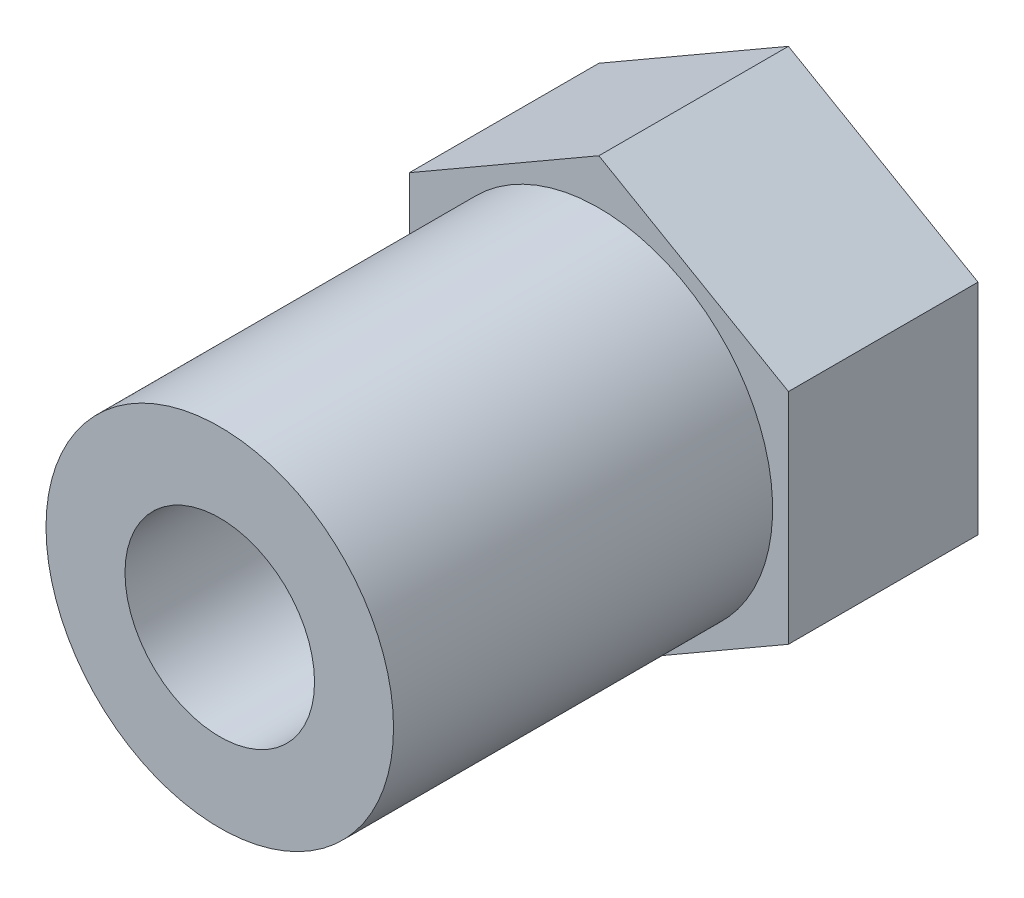
ISO-10303-21;
HEADER;
FILE_DESCRIPTION(('STEP AP214'),'2;1');
FILE_NAME('part.step','',(''),(''),'','','');
FILE_SCHEMA(('AUTOMOTIVE_DESIGN { 1 0 10303 214 1 1 1 1 }'));
ENDSEC;
DATA;
#1=APPLICATION_CONTEXT('core data for automotive mechanical design processes');
#2=APPLICATION_PROTOCOL_DEFINITION('international standard','automotive_design',2000,#1);
#3=PRODUCT_CONTEXT('',#1,'mechanical');
#4=PRODUCT('Part','Part','',(#3));
#5=PRODUCT_RELATED_PRODUCT_CATEGORY('part','',(#4));
#6=PRODUCT_DEFINITION_FORMATION('','',#4);
#7=PRODUCT_DEFINITION_CONTEXT('part definition',#1,'design');
#8=PRODUCT_DEFINITION('design','',#6,#7);
#9=PRODUCT_DEFINITION_SHAPE('','',#8);
#10=(LENGTH_UNIT() NAMED_UNIT(*) SI_UNIT(.MILLI.,.METRE.));
#11=(NAMED_UNIT(*) PLANE_ANGLE_UNIT() SI_UNIT($,.RADIAN.));
#12=(NAMED_UNIT(*) SI_UNIT($,.STERADIAN.) SOLID_ANGLE_UNIT());
#13=UNCERTAINTY_MEASURE_WITH_UNIT(LENGTH_MEASURE(1.E-05),#10,'distance_accuracy_value','');
#14=(GEOMETRIC_REPRESENTATION_CONTEXT(3) GLOBAL_UNCERTAINTY_ASSIGNED_CONTEXT((#13)) GLOBAL_UNIT_ASSIGNED_CONTEXT((#10,
#11,#12)) REPRESENTATION_CONTEXT('',''));
#15=CARTESIAN_POINT('',(0.,0.,0.));
#16=DIRECTION('',(0.,0.,1.));
#17=DIRECTION('',(1.,0.,0.));
#18=AXIS2_PLACEMENT_3D('',#15,#16,#17);
#19=CARTESIAN_POINT('',(0.,0.,18.));
#20=DIRECTION('',(0.,0.,-1.));
#21=DIRECTION('',(-1.,0.,0.));
#22=AXIS2_PLACEMENT_3D('',#19,#20,#21);
#23=CYLINDRICAL_SURFACE('',#22,5.5);
#24=CARTESIAN_POINT('',(0.,0.,18.));
#25=DIRECTION('',(0.,0.,1.));
#26=DIRECTION('',(1.,0.,0.));
#27=AXIS2_PLACEMENT_3D('',#24,#25,#26);
#28=CIRCLE('',#27,5.5);
#29=CARTESIAN_POINT('',(5.5,0.,18.));
#30=VERTEX_POINT('',#29);
#31=EDGE_CURVE('E44',#30,#30,#28,.T.);
#32=ORIENTED_EDGE('',*,*,#31,.F.);
#33=EDGE_LOOP('',(#32));
#34=FACE_BOUND('',#33,.T.);
#35=CARTESIAN_POINT('',(0.,0.,6.));
#36=DIRECTION('',(0.,0.,-1.));
#37=DIRECTION('',(-1.,0.,0.));
#38=AXIS2_PLACEMENT_3D('',#35,#36,#37);
#39=CIRCLE('',#38,5.5);
#40=CARTESIAN_POINT('',(-5.5,0.,6.));
#41=VERTEX_POINT('',#40);
#42=EDGE_CURVE('E11',#41,#41,#39,.T.);
#43=ORIENTED_EDGE('',*,*,#42,.F.);
#44=EDGE_LOOP('',(#43));
#45=FACE_BOUND('',#44,.T.);
#46=ADVANCED_FACE('F36',(#34,#45),#23,.T.);
#47=CARTESIAN_POINT('',(0.,0.,18.));
#48=DIRECTION('',(0.,0.,1.));
#49=DIRECTION('',(1.,0.,0.));
#50=AXIS2_PLACEMENT_3D('',#47,#48,#49);
#51=PLANE('',#50);
#52=CARTESIAN_POINT('',(0.,0.,18.));
#53=DIRECTION('',(0.,0.,1.));
#54=DIRECTION('',(1.,0.,0.));
#55=AXIS2_PLACEMENT_3D('',#52,#53,#54);
#56=CIRCLE('',#55,3.);
#57=CARTESIAN_POINT('',(3.,0.,18.));
#58=VERTEX_POINT('',#57);
#59=EDGE_CURVE('E188',#58,#58,#56,.T.);
#60=ORIENTED_EDGE('',*,*,#59,.F.);
#61=EDGE_LOOP('',(#60));
#62=FACE_BOUND('',#61,.T.);
#63=ORIENTED_EDGE('',*,*,#31,.T.);
#64=EDGE_LOOP('',(#63));
#65=FACE_BOUND('',#64,.T.);
#66=ADVANCED_FACE('F148',(#62,#65),#51,.T.);
#67=CARTESIAN_POINT('',(-6.,3.46410161513776,6.));
#68=DIRECTION('',(-0.5,0.866025403784439,0.));
#69=DIRECTION('',(-0.866025403784439,-0.5,0.));
#70=AXIS2_PLACEMENT_3D('',#67,#68,#69);
#71=PLANE('',#70);
#72=DIRECTION('',(0.866025403784439,0.5,0.));
#73=VECTOR('',#72,1.);
#74=CARTESIAN_POINT('',(-6.,3.46410161513776,0.));
#75=LINE('',#74,#73);
#76=CARTESIAN_POINT('',(-6.,3.46410161513776,0.));
#77=VERTEX_POINT('',#76);
#78=CARTESIAN_POINT('',(0.,6.92820323027551,0.));
#79=VERTEX_POINT('',#78);
#80=EDGE_CURVE('E123',#77,#79,#75,.T.);
#81=ORIENTED_EDGE('',*,*,#80,.F.);
#82=DIRECTION('',(0.,0.,-1.));
#83=VECTOR('',#82,1.);
#84=CARTESIAN_POINT('',(-6.,3.46410161513776,6.));
#85=LINE('',#84,#83);
#86=CARTESIAN_POINT('',(-6.,3.46410161513776,6.));
#87=VERTEX_POINT('',#86);
#88=EDGE_CURVE('E52',#87,#77,#85,.T.);
#89=ORIENTED_EDGE('',*,*,#88,.F.);
#90=DIRECTION('',(0.866025403784439,0.5,0.));
#91=VECTOR('',#90,1.);
#92=CARTESIAN_POINT('',(-6.,3.46410161513776,6.));
#93=LINE('',#92,#91);
#94=CARTESIAN_POINT('',(0.,6.92820323027551,6.));
#95=VERTEX_POINT('',#94);
#96=EDGE_CURVE('E139',#87,#95,#93,.T.);
#97=ORIENTED_EDGE('',*,*,#96,.T.);
#98=DIRECTION('',(0.,0.,-1.));
#99=VECTOR('',#98,1.);
#100=CARTESIAN_POINT('',(0.,6.92820323027551,6.));
#101=LINE('',#100,#99);
#102=EDGE_CURVE('E87',#95,#79,#101,.T.);
#103=ORIENTED_EDGE('',*,*,#102,.T.);
#104=EDGE_LOOP('',(#81,#89,#97,#103));
#105=FACE_BOUND('',#104,.T.);
#106=ADVANCED_FACE('F172',(#105),#71,.T.);
#107=CARTESIAN_POINT('',(-6.,-3.46410161513775,6.));
#108=DIRECTION('',(-1.,0.,0.));
#109=DIRECTION('',(0.,0.,1.));
#110=AXIS2_PLACEMENT_3D('',#107,#108,#109);
#111=PLANE('',#110);
#112=DIRECTION('',(0.,1.,0.));
#113=VECTOR('',#112,1.);
#114=CARTESIAN_POINT('',(-6.,-3.46410161513775,0.));
#115=LINE('',#114,#113);
#116=CARTESIAN_POINT('',(-6.,-3.46410161513775,0.));
#117=VERTEX_POINT('',#116);
#118=EDGE_CURVE('E136',#117,#77,#115,.T.);
#119=ORIENTED_EDGE('',*,*,#118,.F.);
#120=DIRECTION('',(0.,0.,-1.));
#121=VECTOR('',#120,1.);
#122=CARTESIAN_POINT('',(-6.,-3.46410161513775,6.));
#123=LINE('',#122,#121);
#124=CARTESIAN_POINT('',(-6.,-3.46410161513775,6.));
#125=VERTEX_POINT('',#124);
#126=EDGE_CURVE('E75',#125,#117,#123,.T.);
#127=ORIENTED_EDGE('',*,*,#126,.F.);
#128=DIRECTION('',(0.,1.,0.));
#129=VECTOR('',#128,1.);
#130=CARTESIAN_POINT('',(-6.,-3.46410161513775,6.));
#131=LINE('',#130,#129);
#132=EDGE_CURVE('E113',#125,#87,#131,.T.);
#133=ORIENTED_EDGE('',*,*,#132,.T.);
#134=ORIENTED_EDGE('',*,*,#88,.T.);
#135=EDGE_LOOP('',(#119,#127,#133,#134));
#136=FACE_BOUND('',#135,.T.);
#137=ADVANCED_FACE('F169',(#136),#111,.T.);
#138=CARTESIAN_POINT('',(0.,-6.92820323027551,6.));
#139=DIRECTION('',(-0.5,-0.866025403784439,0.));
#140=DIRECTION('',(0.866025403784439,-0.5,0.));
#141=AXIS2_PLACEMENT_3D('',#138,#139,#140);
#142=PLANE('',#141);
#143=DIRECTION('',(-0.866025403784439,0.5,0.));
#144=VECTOR('',#143,1.);
#145=CARTESIAN_POINT('',(0.,-6.92820323027551,0.));
#146=LINE('',#145,#144);
#147=CARTESIAN_POINT('',(0.,-6.92820323027551,0.));
#148=VERTEX_POINT('',#147);
#149=EDGE_CURVE('E100',#148,#117,#146,.T.);
#150=ORIENTED_EDGE('',*,*,#149,.F.);
#151=DIRECTION('',(0.,0.,-1.));
#152=VECTOR('',#151,1.);
#153=CARTESIAN_POINT('',(0.,-6.92820323027551,6.));
#154=LINE('',#153,#152);
#155=CARTESIAN_POINT('',(0.,-6.92820323027551,6.));
#156=VERTEX_POINT('',#155);
#157=EDGE_CURVE('E95',#156,#148,#154,.T.);
#158=ORIENTED_EDGE('',*,*,#157,.F.);
#159=DIRECTION('',(-0.866025403784439,0.5,0.));
#160=VECTOR('',#159,1.);
#161=CARTESIAN_POINT('',(0.,-6.92820323027551,6.));
#162=LINE('',#161,#160);
#163=EDGE_CURVE('E98',#156,#125,#162,.T.);
#164=ORIENTED_EDGE('',*,*,#163,.T.);
#165=ORIENTED_EDGE('',*,*,#126,.T.);
#166=EDGE_LOOP('',(#150,#158,#164,#165));
#167=FACE_BOUND('',#166,.T.);
#168=ADVANCED_FACE('F97',(#167),#142,.T.);
#169=CARTESIAN_POINT('',(6.,-3.46410161513775,6.));
#170=DIRECTION('',(0.5,-0.866025403784438,0.));
#171=DIRECTION('',(0.866025403784439,0.5,0.));
#172=AXIS2_PLACEMENT_3D('',#169,#170,#171);
#173=PLANE('',#172);
#174=DIRECTION('',(-0.866025403784439,-0.5,0.));
#175=VECTOR('',#174,1.);
#176=CARTESIAN_POINT('',(6.,-3.46410161513775,0.));
#177=LINE('',#176,#175);
#178=CARTESIAN_POINT('',(6.,-3.46410161513775,0.));
#179=VERTEX_POINT('',#178);
#180=EDGE_CURVE('E133',#179,#148,#177,.T.);
#181=ORIENTED_EDGE('',*,*,#180,.F.);
#182=DIRECTION('',(0.,0.,-1.));
#183=VECTOR('',#182,1.);
#184=CARTESIAN_POINT('',(6.,-3.46410161513775,6.));
#185=LINE('',#184,#183);
#186=CARTESIAN_POINT('',(6.,-3.46410161513775,6.));
#187=VERTEX_POINT('',#186);
#188=EDGE_CURVE('E105',#187,#179,#185,.T.);
#189=ORIENTED_EDGE('',*,*,#188,.F.);
#190=DIRECTION('',(-0.866025403784439,-0.5,0.));
#191=VECTOR('',#190,1.);
#192=CARTESIAN_POINT('',(6.,-3.46410161513775,6.));
#193=LINE('',#192,#191);
#194=EDGE_CURVE('E111',#187,#156,#193,.T.);
#195=ORIENTED_EDGE('',*,*,#194,.T.);
#196=ORIENTED_EDGE('',*,*,#157,.T.);
#197=EDGE_LOOP('',(#181,#189,#195,#196));
#198=FACE_BOUND('',#197,.T.);
#199=ADVANCED_FACE('F115',(#198),#173,.T.);
#200=CARTESIAN_POINT('',(6.,3.46410161513776,6.));
#201=DIRECTION('',(1.,0.,0.));
#202=DIRECTION('',(0.,1.,0.));
#203=AXIS2_PLACEMENT_3D('',#200,#201,#202);
#204=PLANE('',#203);
#205=DIRECTION('',(0.,-1.,0.));
#206=VECTOR('',#205,1.);
#207=CARTESIAN_POINT('',(6.,3.46410161513776,0.));
#208=LINE('',#207,#206);
#209=CARTESIAN_POINT('',(6.,3.46410161513776,0.));
#210=VERTEX_POINT('',#209);
#211=EDGE_CURVE('E130',#210,#179,#208,.T.);
#212=ORIENTED_EDGE('',*,*,#211,.F.);
#213=DIRECTION('',(0.,0.,-1.));
#214=VECTOR('',#213,1.);
#215=CARTESIAN_POINT('',(6.,3.46410161513776,6.));
#216=LINE('',#215,#214);
#217=CARTESIAN_POINT('',(6.,3.46410161513776,6.));
#218=VERTEX_POINT('',#217);
#219=EDGE_CURVE('E143',#218,#210,#216,.T.);
#220=ORIENTED_EDGE('',*,*,#219,.F.);
#221=DIRECTION('',(0.,-1.,0.));
#222=VECTOR('',#221,1.);
#223=CARTESIAN_POINT('',(6.,3.46410161513776,6.));
#224=LINE('',#223,#222);
#225=EDGE_CURVE('E116',#218,#187,#224,.T.);
#226=ORIENTED_EDGE('',*,*,#225,.T.);
#227=ORIENTED_EDGE('',*,*,#188,.T.);
#228=EDGE_LOOP('',(#212,#220,#226,#227));
#229=FACE_BOUND('',#228,.T.);
#230=ADVANCED_FACE('F164',(#229),#204,.T.);
#231=CARTESIAN_POINT('',(0.,6.92820323027551,6.));
#232=DIRECTION('',(0.5,0.866025403784439,0.));
#233=DIRECTION('',(-0.866025403784439,0.5,0.));
#234=AXIS2_PLACEMENT_3D('',#231,#232,#233);
#235=PLANE('',#234);
#236=DIRECTION('',(0.866025403784439,-0.5,0.));
#237=VECTOR('',#236,1.);
#238=CARTESIAN_POINT('',(0.,6.92820323027551,0.));
#239=LINE('',#238,#237);
#240=EDGE_CURVE('E126',#79,#210,#239,.T.);
#241=ORIENTED_EDGE('',*,*,#240,.F.);
#242=ORIENTED_EDGE('',*,*,#102,.F.);
#243=DIRECTION('',(0.866025403784439,-0.5,0.));
#244=VECTOR('',#243,1.);
#245=CARTESIAN_POINT('',(0.,6.92820323027551,6.));
#246=LINE('',#245,#244);
#247=EDGE_CURVE('E118',#95,#218,#246,.T.);
#248=ORIENTED_EDGE('',*,*,#247,.T.);
#249=ORIENTED_EDGE('',*,*,#219,.T.);
#250=EDGE_LOOP('',(#241,#242,#248,#249));
#251=FACE_BOUND('',#250,.T.);
#252=ADVANCED_FACE('F156',(#251),#235,.T.);
#253=CARTESIAN_POINT('',(0.,0.,6.));
#254=DIRECTION('',(0.,0.,-1.));
#255=DIRECTION('',(-1.,0.,0.));
#256=AXIS2_PLACEMENT_3D('',#253,#254,#255);
#257=PLANE('',#256);
#258=ORIENTED_EDGE('',*,*,#42,.T.);
#259=EDGE_LOOP('',(#258));
#260=FACE_BOUND('',#259,.T.);
#261=ORIENTED_EDGE('',*,*,#96,.F.);
#262=ORIENTED_EDGE('',*,*,#132,.F.);
#263=ORIENTED_EDGE('',*,*,#163,.F.);
#264=ORIENTED_EDGE('',*,*,#194,.F.);
#265=ORIENTED_EDGE('',*,*,#225,.F.);
#266=ORIENTED_EDGE('',*,*,#247,.F.);
#267=EDGE_LOOP('',(#261,#262,#263,#264,#265,#266));
#268=FACE_BOUND('',#267,.T.);
#269=ADVANCED_FACE('F109',(#260,#268),#257,.F.);
#270=CARTESIAN_POINT('',(0.,0.,0.));
#271=DIRECTION('',(0.,0.,1.));
#272=DIRECTION('',(1.,0.,0.));
#273=AXIS2_PLACEMENT_3D('',#270,#271,#272);
#274=PLANE('',#273);
#275=CARTESIAN_POINT('',(0.,0.,0.));
#276=DIRECTION('',(0.,0.,-1.));
#277=DIRECTION('',(-1.,0.,0.));
#278=AXIS2_PLACEMENT_3D('',#275,#276,#277);
#279=CIRCLE('',#278,1.5);
#280=CARTESIAN_POINT('',(-1.5,0.,0.));
#281=VERTEX_POINT('',#280);
#282=EDGE_CURVE('E195',#281,#281,#279,.T.);
#283=ORIENTED_EDGE('',*,*,#282,.F.);
#284=EDGE_LOOP('',(#283));
#285=FACE_BOUND('',#284,.T.);
#286=ORIENTED_EDGE('',*,*,#80,.T.);
#287=ORIENTED_EDGE('',*,*,#240,.T.);
#288=ORIENTED_EDGE('',*,*,#211,.T.);
#289=ORIENTED_EDGE('',*,*,#180,.T.);
#290=ORIENTED_EDGE('',*,*,#149,.T.);
#291=ORIENTED_EDGE('',*,*,#118,.T.);
#292=EDGE_LOOP('',(#286,#287,#288,#289,#290,#291));
#293=FACE_BOUND('',#292,.T.);
#294=ADVANCED_FACE('F155',(#285,#293),#274,.F.);
#295=CARTESIAN_POINT('',(0.,0.,5.99999999999999));
#296=DIRECTION('',(0.,0.,1.));
#297=DIRECTION('',(1.,0.,0.));
#298=AXIS2_PLACEMENT_3D('',#295,#296,#297);
#299=CYLINDRICAL_SURFACE('',#298,3.);
#300=CARTESIAN_POINT('',(0.,0.,5.99999999999999));
#301=DIRECTION('',(0.,0.,1.));
#302=DIRECTION('',(1.,0.,0.));
#303=AXIS2_PLACEMENT_3D('',#300,#301,#302);
#304=CIRCLE('',#303,3.);
#305=CARTESIAN_POINT('',(3.,0.,5.99999999999999));
#306=VERTEX_POINT('',#305);
#307=EDGE_CURVE('E127',#306,#306,#304,.T.);
#308=ORIENTED_EDGE('',*,*,#307,.F.);
#309=EDGE_LOOP('',(#308));
#310=FACE_BOUND('',#309,.T.);
#311=ORIENTED_EDGE('',*,*,#59,.T.);
#312=EDGE_LOOP('',(#311));
#313=FACE_BOUND('',#312,.T.);
#314=ADVANCED_FACE('F162',(#310,#313),#299,.F.);
#315=CARTESIAN_POINT('',(0.,0.,5.99999999999999));
#316=DIRECTION('',(0.,0.,1.));
#317=DIRECTION('',(1.,0.,0.));
#318=AXIS2_PLACEMENT_3D('',#315,#316,#317);
#319=PLANE('',#318);
#320=CARTESIAN_POINT('',(0.,0.,6.));
#321=DIRECTION('',(0.,0.,-1.));
#322=DIRECTION('',(-1.,0.,0.));
#323=AXIS2_PLACEMENT_3D('',#320,#321,#322);
#324=CIRCLE('',#323,1.5);
#325=CARTESIAN_POINT('',(-1.5,0.,6.));
#326=VERTEX_POINT('',#325);
#327=EDGE_CURVE('E190',#326,#326,#324,.T.);
#328=ORIENTED_EDGE('',*,*,#327,.T.);
#329=EDGE_LOOP('',(#328));
#330=FACE_BOUND('',#329,.T.);
#331=ORIENTED_EDGE('',*,*,#307,.T.);
#332=EDGE_LOOP('',(#331));
#333=FACE_BOUND('',#332,.T.);
#334=ADVANCED_FACE('F206',(#330,#333),#319,.T.);
#335=CARTESIAN_POINT('',(0.,0.,6.));
#336=DIRECTION('',(0.,0.,-1.));
#337=DIRECTION('',(-1.,0.,0.));
#338=AXIS2_PLACEMENT_3D('',#335,#336,#337);
#339=CYLINDRICAL_SURFACE('',#338,1.5);
#340=ORIENTED_EDGE('',*,*,#327,.F.);
#341=EDGE_LOOP('',(#340));
#342=FACE_BOUND('',#341,.T.);
#343=ORIENTED_EDGE('',*,*,#282,.T.);
#344=EDGE_LOOP('',(#343));
#345=FACE_BOUND('',#344,.T.);
#346=ADVANCED_FACE('F204',(#342,#345),#339,.F.);
#347=CLOSED_SHELL('',(#46,#66,#106,#137,#168,#199,#230,#252,#269,#294,#314,#334,#346));
#348=MANIFOLD_SOLID_BREP('B2',#347);
#349=ADVANCED_BREP_SHAPE_REPRESENTATION('',(#18,#348),#14);
#350=SHAPE_DEFINITION_REPRESENTATION(#9,#349);
ENDSEC;
END-ISO-10303-21;
